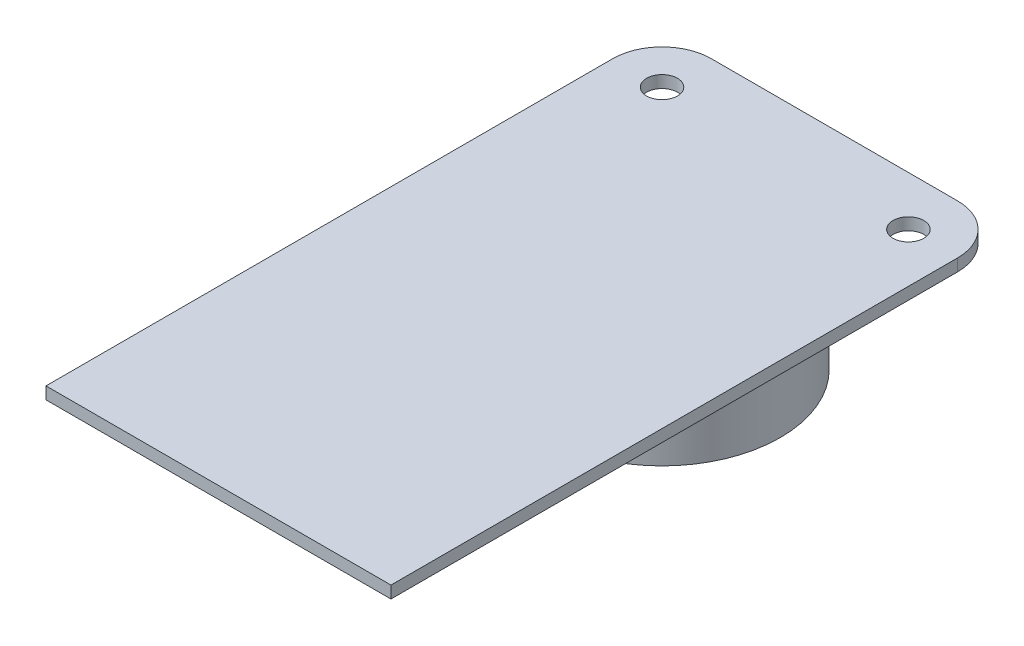
ISO-10303-21;
HEADER;
FILE_DESCRIPTION(('STEP AP214'),'2;1');
FILE_NAME('part.step','',(''),(''),'','','');
FILE_SCHEMA(('AUTOMOTIVE_DESIGN { 1 0 10303 214 1 1 1 1 }'));
ENDSEC;
DATA;
#1=APPLICATION_CONTEXT('core data for automotive mechanical design processes');
#2=APPLICATION_PROTOCOL_DEFINITION('international standard','automotive_design',2000,#1);
#3=PRODUCT_CONTEXT('',#1,'mechanical');
#4=PRODUCT('Part','Part','',(#3));
#5=PRODUCT_RELATED_PRODUCT_CATEGORY('part','',(#4));
#6=PRODUCT_DEFINITION_FORMATION('','',#4);
#7=PRODUCT_DEFINITION_CONTEXT('part definition',#1,'design');
#8=PRODUCT_DEFINITION('design','',#6,#7);
#9=PRODUCT_DEFINITION_SHAPE('','',#8);
#10=(LENGTH_UNIT() NAMED_UNIT(*) SI_UNIT(.MILLI.,.METRE.));
#11=(NAMED_UNIT(*) PLANE_ANGLE_UNIT() SI_UNIT($,.RADIAN.));
#12=(NAMED_UNIT(*) SI_UNIT($,.STERADIAN.) SOLID_ANGLE_UNIT());
#13=UNCERTAINTY_MEASURE_WITH_UNIT(LENGTH_MEASURE(1.E-05),#10,'distance_accuracy_value','');
#14=(GEOMETRIC_REPRESENTATION_CONTEXT(3) GLOBAL_UNCERTAINTY_ASSIGNED_CONTEXT((#13)) GLOBAL_UNIT_ASSIGNED_CONTEXT((#10,
#11,#12)) REPRESENTATION_CONTEXT('',''));
#15=CARTESIAN_POINT('',(0.,0.,0.));
#16=DIRECTION('',(0.,0.,1.));
#17=DIRECTION('',(1.,0.,0.));
#18=AXIS2_PLACEMENT_3D('',#15,#16,#17);
#19=CARTESIAN_POINT('',(5.08,0.5,-5.08));
#20=DIRECTION('',(0.,1.,0.));
#21=DIRECTION('',(0.,0.,1.));
#22=AXIS2_PLACEMENT_3D('',#19,#20,#21);
#23=PLANE('',#22);
#24=CARTESIAN_POINT('',(5.08,0.5,-5.08));
#25=DIRECTION('',(0.,1.,0.));
#26=DIRECTION('',(0.,0.,1.));
#27=AXIS2_PLACEMENT_3D('',#24,#25,#26);
#28=CIRCLE('',#27,0.635000000000001);
#29=CARTESIAN_POINT('',(5.08,0.5,-4.445));
#30=VERTEX_POINT('',#29);
#31=EDGE_CURVE('E121',#30,#30,#28,.T.);
#32=ORIENTED_EDGE('',*,*,#31,.F.);
#33=EDGE_LOOP('',(#32));
#34=FACE_BOUND('',#33,.T.);
#35=CARTESIAN_POINT('',(5.08,0.5,-5.08));
#36=DIRECTION('',(0.,1.,0.));
#37=DIRECTION('',(0.,0.,1.));
#38=AXIS2_PLACEMENT_3D('',#35,#36,#37);
#39=CIRCLE('',#38,2.032);
#40=CARTESIAN_POINT('',(7.112,0.5,-5.08));
#41=VERTEX_POINT('',#40);
#42=CARTESIAN_POINT('',(5.08,0.5,-7.112));
#43=VERTEX_POINT('',#42);
#44=EDGE_CURVE('E128',#41,#43,#39,.T.);
#45=ORIENTED_EDGE('',*,*,#44,.T.);
#46=DIRECTION('',(-1.,0.,0.));
#47=VECTOR('',#46,1.);
#48=CARTESIAN_POINT('',(-5.08,0.5,-7.112));
#49=LINE('',#48,#47);
#50=CARTESIAN_POINT('',(-5.08,0.5,-7.112));
#51=VERTEX_POINT('',#50);
#52=EDGE_CURVE('E86',#43,#51,#49,.T.);
#53=ORIENTED_EDGE('',*,*,#52,.T.);
#54=CARTESIAN_POINT('',(-5.08,0.5,-5.08));
#55=DIRECTION('',(0.,1.,0.));
#56=DIRECTION('',(0.,0.,1.));
#57=AXIS2_PLACEMENT_3D('',#54,#55,#56);
#58=CIRCLE('',#57,2.032);
#59=CARTESIAN_POINT('',(-7.112,0.5,-5.08));
#60=VERTEX_POINT('',#59);
#61=EDGE_CURVE('E99',#51,#60,#58,.T.);
#62=ORIENTED_EDGE('',*,*,#61,.T.);
#63=DIRECTION('',(0.,0.,1.));
#64=VECTOR('',#63,1.);
#65=CARTESIAN_POINT('',(-7.112,0.5,-5.08));
#66=LINE('',#65,#64);
#67=CARTESIAN_POINT('',(-7.112,0.5,18.288));
#68=VERTEX_POINT('',#67);
#69=EDGE_CURVE('E93',#60,#68,#66,.T.);
#70=ORIENTED_EDGE('',*,*,#69,.T.);
#71=DIRECTION('',(1.,0.,0.));
#72=VECTOR('',#71,1.);
#73=CARTESIAN_POINT('',(-7.112,0.5,18.288));
#74=LINE('',#73,#72);
#75=CARTESIAN_POINT('',(7.112,0.5,18.288));
#76=VERTEX_POINT('',#75);
#77=EDGE_CURVE('E97',#68,#76,#74,.T.);
#78=ORIENTED_EDGE('',*,*,#77,.T.);
#79=DIRECTION('',(0.,0.,-1.));
#80=VECTOR('',#79,1.);
#81=CARTESIAN_POINT('',(7.112,0.5,-5.08));
#82=LINE('',#81,#80);
#83=EDGE_CURVE('E49',#76,#41,#82,.T.);
#84=ORIENTED_EDGE('',*,*,#83,.T.);
#85=EDGE_LOOP('',(#45,#53,#62,#70,#78,#84));
#86=FACE_BOUND('',#85,.T.);
#87=CARTESIAN_POINT('',(-5.08,0.5,-5.08));
#88=DIRECTION('',(0.,1.,0.));
#89=DIRECTION('',(0.,0.,1.));
#90=AXIS2_PLACEMENT_3D('',#87,#88,#89);
#91=CIRCLE('',#90,0.635000000000001);
#92=CARTESIAN_POINT('',(-5.08,0.5,-4.445));
#93=VERTEX_POINT('',#92);
#94=EDGE_CURVE('E183',#93,#93,#91,.T.);
#95=ORIENTED_EDGE('',*,*,#94,.F.);
#96=EDGE_LOOP('',(#95));
#97=FACE_BOUND('',#96,.T.);
#98=ADVANCED_FACE('F32',(#34,#86,#97),#23,.T.);
#99=CARTESIAN_POINT('',(5.08,0.,-5.08));
#100=DIRECTION('',(0.,1.,0.));
#101=DIRECTION('',(0.,0.,1.));
#102=AXIS2_PLACEMENT_3D('',#99,#100,#101);
#103=PLANE('',#102);
#104=CARTESIAN_POINT('',(0.,0.,0.));
#105=DIRECTION('',(0.,1.,0.));
#106=DIRECTION('',(0.,0.,1.));
#107=AXIS2_PLACEMENT_3D('',#104,#105,#106);
#108=CIRCLE('',#107,4.875);
#109=CARTESIAN_POINT('',(0.,0.,4.875));
#110=VERTEX_POINT('',#109);
#111=EDGE_CURVE('E180',#110,#110,#108,.T.);
#112=ORIENTED_EDGE('',*,*,#111,.T.);
#113=EDGE_LOOP('',(#112));
#114=FACE_BOUND('',#113,.T.);
#115=CARTESIAN_POINT('',(5.08,0.,-5.08));
#116=DIRECTION('',(0.,1.,0.));
#117=DIRECTION('',(0.,0.,1.));
#118=AXIS2_PLACEMENT_3D('',#115,#116,#117);
#119=CIRCLE('',#118,2.032);
#120=CARTESIAN_POINT('',(7.112,0.,-5.08));
#121=VERTEX_POINT('',#120);
#122=CARTESIAN_POINT('',(5.08,0.,-7.112));
#123=VERTEX_POINT('',#122);
#124=EDGE_CURVE('E117',#121,#123,#119,.T.);
#125=ORIENTED_EDGE('',*,*,#124,.F.);
#126=DIRECTION('',(0.,0.,-1.));
#127=VECTOR('',#126,1.);
#128=CARTESIAN_POINT('',(7.112,0.,-5.08));
#129=LINE('',#128,#127);
#130=CARTESIAN_POINT('',(7.112,0.,18.288));
#131=VERTEX_POINT('',#130);
#132=EDGE_CURVE('E78',#131,#121,#129,.T.);
#133=ORIENTED_EDGE('',*,*,#132,.F.);
#134=DIRECTION('',(1.,0.,0.));
#135=VECTOR('',#134,1.);
#136=CARTESIAN_POINT('',(-7.112,0.,18.288));
#137=LINE('',#136,#135);
#138=CARTESIAN_POINT('',(-7.112,0.,18.288));
#139=VERTEX_POINT('',#138);
#140=EDGE_CURVE('E72',#139,#131,#137,.T.);
#141=ORIENTED_EDGE('',*,*,#140,.F.);
#142=DIRECTION('',(0.,0.,1.));
#143=VECTOR('',#142,1.);
#144=CARTESIAN_POINT('',(-7.112,0.,-5.08));
#145=LINE('',#144,#143);
#146=CARTESIAN_POINT('',(-7.112,0.,-5.08));
#147=VERTEX_POINT('',#146);
#148=EDGE_CURVE('E107',#147,#139,#145,.T.);
#149=ORIENTED_EDGE('',*,*,#148,.F.);
#150=CARTESIAN_POINT('',(-5.08,0.,-5.08));
#151=DIRECTION('',(0.,1.,0.));
#152=DIRECTION('',(0.,0.,1.));
#153=AXIS2_PLACEMENT_3D('',#150,#151,#152);
#154=CIRCLE('',#153,2.032);
#155=CARTESIAN_POINT('',(-5.08,0.,-7.112));
#156=VERTEX_POINT('',#155);
#157=EDGE_CURVE('E123',#156,#147,#154,.T.);
#158=ORIENTED_EDGE('',*,*,#157,.F.);
#159=DIRECTION('',(-1.,0.,0.));
#160=VECTOR('',#159,1.);
#161=CARTESIAN_POINT('',(-5.08,0.,-7.112));
#162=LINE('',#161,#160);
#163=EDGE_CURVE('E120',#123,#156,#162,.T.);
#164=ORIENTED_EDGE('',*,*,#163,.F.);
#165=EDGE_LOOP('',(#125,#133,#141,#149,#158,#164));
#166=FACE_BOUND('',#165,.T.);
#167=CARTESIAN_POINT('',(5.08,0.,-5.08));
#168=DIRECTION('',(0.,1.,0.));
#169=DIRECTION('',(0.,0.,1.));
#170=AXIS2_PLACEMENT_3D('',#167,#168,#169);
#171=CIRCLE('',#170,0.635000000000001);
#172=CARTESIAN_POINT('',(5.08,0.,-4.445));
#173=VERTEX_POINT('',#172);
#174=EDGE_CURVE('E189',#173,#173,#171,.T.);
#175=ORIENTED_EDGE('',*,*,#174,.T.);
#176=EDGE_LOOP('',(#175));
#177=FACE_BOUND('',#176,.T.);
#178=CARTESIAN_POINT('',(-5.08,0.,-5.08));
#179=DIRECTION('',(0.,1.,0.));
#180=DIRECTION('',(0.,0.,1.));
#181=AXIS2_PLACEMENT_3D('',#178,#179,#180);
#182=CIRCLE('',#181,0.635000000000001);
#183=CARTESIAN_POINT('',(-5.08,0.,-4.445));
#184=VERTEX_POINT('',#183);
#185=EDGE_CURVE('E179',#184,#184,#182,.T.);
#186=ORIENTED_EDGE('',*,*,#185,.T.);
#187=EDGE_LOOP('',(#186));
#188=FACE_BOUND('',#187,.T.);
#189=ADVANCED_FACE('F137',(#114,#166,#177,#188),#103,.F.);
#190=CARTESIAN_POINT('',(5.08,0.5,-5.08));
#191=DIRECTION('',(0.,-1.,0.));
#192=DIRECTION('',(0.,0.,-1.));
#193=AXIS2_PLACEMENT_3D('',#190,#191,#192);
#194=CYLINDRICAL_SURFACE('',#193,2.032);
#195=ORIENTED_EDGE('',*,*,#124,.T.);
#196=DIRECTION('',(0.,-1.,0.));
#197=VECTOR('',#196,1.);
#198=CARTESIAN_POINT('',(5.08,0.5,-7.112));
#199=LINE('',#198,#197);
#200=EDGE_CURVE('E11',#43,#123,#199,.T.);
#201=ORIENTED_EDGE('',*,*,#200,.F.);
#202=ORIENTED_EDGE('',*,*,#44,.F.);
#203=DIRECTION('',(0.,-1.,0.));
#204=VECTOR('',#203,1.);
#205=CARTESIAN_POINT('',(7.112,0.5,-5.08));
#206=LINE('',#205,#204);
#207=EDGE_CURVE('E113',#41,#121,#206,.T.);
#208=ORIENTED_EDGE('',*,*,#207,.T.);
#209=EDGE_LOOP('',(#195,#201,#202,#208));
#210=FACE_BOUND('',#209,.T.);
#211=ADVANCED_FACE('F34',(#210),#194,.T.);
#212=CARTESIAN_POINT('',(-5.08,0.5,-7.112));
#213=DIRECTION('',(0.,0.,1.));
#214=DIRECTION('',(1.,0.,0.));
#215=AXIS2_PLACEMENT_3D('',#212,#213,#214);
#216=PLANE('',#215);
#217=ORIENTED_EDGE('',*,*,#163,.T.);
#218=DIRECTION('',(0.,-1.,0.));
#219=VECTOR('',#218,1.);
#220=CARTESIAN_POINT('',(-5.08,0.5,-7.112));
#221=LINE('',#220,#219);
#222=EDGE_CURVE('E41',#51,#156,#221,.T.);
#223=ORIENTED_EDGE('',*,*,#222,.F.);
#224=ORIENTED_EDGE('',*,*,#52,.F.);
#225=ORIENTED_EDGE('',*,*,#200,.T.);
#226=EDGE_LOOP('',(#217,#223,#224,#225));
#227=FACE_BOUND('',#226,.T.);
#228=ADVANCED_FACE('F244',(#227),#216,.F.);
#229=CARTESIAN_POINT('',(-5.08,0.5,-5.08));
#230=DIRECTION('',(0.,-1.,0.));
#231=DIRECTION('',(0.,0.,-1.));
#232=AXIS2_PLACEMENT_3D('',#229,#230,#231);
#233=CYLINDRICAL_SURFACE('',#232,2.032);
#234=ORIENTED_EDGE('',*,*,#157,.T.);
#235=DIRECTION('',(0.,-1.,0.));
#236=VECTOR('',#235,1.);
#237=CARTESIAN_POINT('',(-7.112,0.5,-5.08));
#238=LINE('',#237,#236);
#239=EDGE_CURVE('E108',#60,#147,#238,.T.);
#240=ORIENTED_EDGE('',*,*,#239,.F.);
#241=ORIENTED_EDGE('',*,*,#61,.F.);
#242=ORIENTED_EDGE('',*,*,#222,.T.);
#243=EDGE_LOOP('',(#234,#240,#241,#242));
#244=FACE_BOUND('',#243,.T.);
#245=ADVANCED_FACE('F134',(#244),#233,.T.);
#246=CARTESIAN_POINT('',(-7.112,0.5,-5.08));
#247=DIRECTION('',(1.,0.,0.));
#248=DIRECTION('',(0.,0.,-1.));
#249=AXIS2_PLACEMENT_3D('',#246,#247,#248);
#250=PLANE('',#249);
#251=ORIENTED_EDGE('',*,*,#148,.T.);
#252=DIRECTION('',(0.,-1.,0.));
#253=VECTOR('',#252,1.);
#254=CARTESIAN_POINT('',(-7.112,0.5,18.288));
#255=LINE('',#254,#253);
#256=EDGE_CURVE('E104',#68,#139,#255,.T.);
#257=ORIENTED_EDGE('',*,*,#256,.F.);
#258=ORIENTED_EDGE('',*,*,#69,.F.);
#259=ORIENTED_EDGE('',*,*,#239,.T.);
#260=EDGE_LOOP('',(#251,#257,#258,#259));
#261=FACE_BOUND('',#260,.T.);
#262=ADVANCED_FACE('F105',(#261),#250,.F.);
#263=CARTESIAN_POINT('',(-7.112,0.5,18.288));
#264=DIRECTION('',(0.,0.,-1.));
#265=DIRECTION('',(-1.,0.,0.));
#266=AXIS2_PLACEMENT_3D('',#263,#264,#265);
#267=PLANE('',#266);
#268=ORIENTED_EDGE('',*,*,#140,.T.);
#269=DIRECTION('',(0.,-1.,0.));
#270=VECTOR('',#269,1.);
#271=CARTESIAN_POINT('',(7.112,0.5,18.288));
#272=LINE('',#271,#270);
#273=EDGE_CURVE('E109',#76,#131,#272,.T.);
#274=ORIENTED_EDGE('',*,*,#273,.F.);
#275=ORIENTED_EDGE('',*,*,#77,.F.);
#276=ORIENTED_EDGE('',*,*,#256,.T.);
#277=EDGE_LOOP('',(#268,#274,#275,#276));
#278=FACE_BOUND('',#277,.T.);
#279=ADVANCED_FACE('F111',(#278),#267,.F.);
#280=CARTESIAN_POINT('',(7.112,0.5,-5.08));
#281=DIRECTION('',(-1.,0.,0.));
#282=DIRECTION('',(0.,0.,1.));
#283=AXIS2_PLACEMENT_3D('',#280,#281,#282);
#284=PLANE('',#283);
#285=ORIENTED_EDGE('',*,*,#132,.T.);
#286=ORIENTED_EDGE('',*,*,#207,.F.);
#287=ORIENTED_EDGE('',*,*,#83,.F.);
#288=ORIENTED_EDGE('',*,*,#273,.T.);
#289=EDGE_LOOP('',(#285,#286,#287,#288));
#290=FACE_BOUND('',#289,.T.);
#291=ADVANCED_FACE('F142',(#290),#284,.F.);
#292=CARTESIAN_POINT('',(5.08,0.5,-5.08));
#293=DIRECTION('',(0.,-1.,0.));
#294=DIRECTION('',(0.,0.,-1.));
#295=AXIS2_PLACEMENT_3D('',#292,#293,#294);
#296=CYLINDRICAL_SURFACE('',#295,0.635000000000001);
#297=ORIENTED_EDGE('',*,*,#31,.T.);
#298=EDGE_LOOP('',(#297));
#299=FACE_BOUND('',#298,.T.);
#300=ORIENTED_EDGE('',*,*,#174,.F.);
#301=EDGE_LOOP('',(#300));
#302=FACE_BOUND('',#301,.T.);
#303=ADVANCED_FACE('F144',(#299,#302),#296,.F.);
#304=CARTESIAN_POINT('',(-5.08,0.5,-5.08));
#305=DIRECTION('',(0.,-1.,0.));
#306=DIRECTION('',(0.,0.,-1.));
#307=AXIS2_PLACEMENT_3D('',#304,#305,#306);
#308=CYLINDRICAL_SURFACE('',#307,0.635000000000001);
#309=ORIENTED_EDGE('',*,*,#94,.T.);
#310=EDGE_LOOP('',(#309));
#311=FACE_BOUND('',#310,.T.);
#312=ORIENTED_EDGE('',*,*,#185,.F.);
#313=EDGE_LOOP('',(#312));
#314=FACE_BOUND('',#313,.T.);
#315=ADVANCED_FACE('F150',(#311,#314),#308,.F.);
#316=CARTESIAN_POINT('',(0.,-4.5,0.));
#317=DIRECTION('',(0.,1.,0.));
#318=DIRECTION('',(0.,0.,1.));
#319=AXIS2_PLACEMENT_3D('',#316,#317,#318);
#320=CYLINDRICAL_SURFACE('',#319,4.875);
#321=CARTESIAN_POINT('',(0.,-4.5,0.));
#322=DIRECTION('',(0.,1.,0.));
#323=DIRECTION('',(0.,0.,1.));
#324=AXIS2_PLACEMENT_3D('',#321,#322,#323);
#325=CIRCLE('',#324,4.875);
#326=CARTESIAN_POINT('',(0.,-4.5,4.875));
#327=VERTEX_POINT('',#326);
#328=EDGE_CURVE('E178',#327,#327,#325,.T.);
#329=ORIENTED_EDGE('',*,*,#328,.T.);
#330=EDGE_LOOP('',(#329));
#331=FACE_BOUND('',#330,.T.);
#332=ORIENTED_EDGE('',*,*,#111,.F.);
#333=EDGE_LOOP('',(#332));
#334=FACE_BOUND('',#333,.T.);
#335=ADVANCED_FACE('F166',(#331,#334),#320,.T.);
#336=CARTESIAN_POINT('',(0.,-4.5,0.));
#337=DIRECTION('',(0.,1.,0.));
#338=DIRECTION('',(0.,0.,1.));
#339=AXIS2_PLACEMENT_3D('',#336,#337,#338);
#340=PLANE('',#339);
#341=ORIENTED_EDGE('',*,*,#328,.F.);
#342=EDGE_LOOP('',(#341));
#343=FACE_BOUND('',#342,.T.);
#344=ADVANCED_FACE('F170',(#343),#340,.F.);
#345=CLOSED_SHELL('',(#98,#189,#211,#228,#245,#262,#279,#291,#303,#315,#335,#344));
#346=MANIFOLD_SOLID_BREP('B2',#345);
#347=ADVANCED_BREP_SHAPE_REPRESENTATION('',(#18,#346),#14);
#348=SHAPE_DEFINITION_REPRESENTATION(#9,#347);
ENDSEC;
END-ISO-10303-21;
